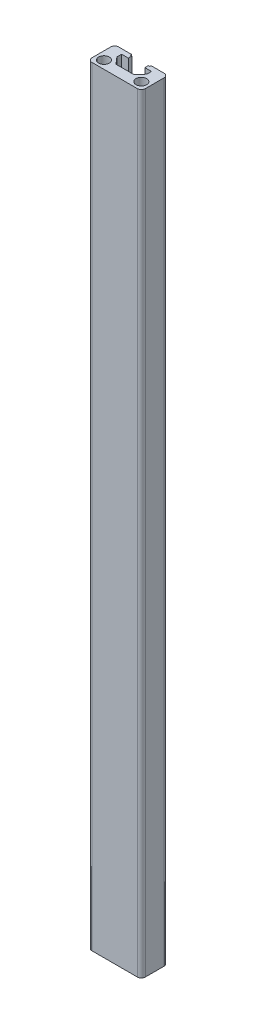
ISO-10303-21;
HEADER;
FILE_DESCRIPTION(('STEP AP214'),'2;1');
FILE_NAME('part.step','',(''),(''),'','','');
FILE_SCHEMA(('AUTOMOTIVE_DESIGN { 1 0 10303 214 1 1 1 1 }'));
ENDSEC;
DATA;
#1=APPLICATION_CONTEXT('core data for automotive mechanical design processes');
#2=APPLICATION_PROTOCOL_DEFINITION('international standard','automotive_design',2000,#1);
#3=PRODUCT_CONTEXT('',#1,'mechanical');
#4=PRODUCT('Part','Part','',(#3));
#5=PRODUCT_RELATED_PRODUCT_CATEGORY('part','',(#4));
#6=PRODUCT_DEFINITION_FORMATION('','',#4);
#7=PRODUCT_DEFINITION_CONTEXT('part definition',#1,'design');
#8=PRODUCT_DEFINITION('design','',#6,#7);
#9=PRODUCT_DEFINITION_SHAPE('','',#8);
#10=(LENGTH_UNIT() NAMED_UNIT(*) SI_UNIT(.MILLI.,.METRE.));
#11=(NAMED_UNIT(*) PLANE_ANGLE_UNIT() SI_UNIT($,.RADIAN.));
#12=(NAMED_UNIT(*) SI_UNIT($,.STERADIAN.) SOLID_ANGLE_UNIT());
#13=UNCERTAINTY_MEASURE_WITH_UNIT(LENGTH_MEASURE(1.E-05),#10,'distance_accuracy_value','');
#14=(GEOMETRIC_REPRESENTATION_CONTEXT(3) GLOBAL_UNCERTAINTY_ASSIGNED_CONTEXT((#13)) GLOBAL_UNIT_ASSIGNED_CONTEXT((#10,
#11,#12)) REPRESENTATION_CONTEXT('',''));
#15=CARTESIAN_POINT('',(0.,0.,0.));
#16=DIRECTION('',(0.,0.,1.));
#17=DIRECTION('',(1.,0.,0.));
#18=AXIS2_PLACEMENT_3D('',#15,#16,#17);
#19=CARTESIAN_POINT('',(0.,288.,0.));
#20=DIRECTION('',(0.,1.,0.));
#21=DIRECTION('',(0.,0.,1.));
#22=AXIS2_PLACEMENT_3D('',#19,#20,#21);
#23=PLANE('',#22);
#24=CARTESIAN_POINT('',(17.,288.,-3.));
#25=DIRECTION('',(0.,1.,0.));
#26=DIRECTION('',(0.,0.,1.));
#27=AXIS2_PLACEMENT_3D('',#24,#25,#26);
#28=CIRCLE('',#27,2.);
#29=CARTESIAN_POINT('',(17.,288.,-0.999999999999997));
#30=VERTEX_POINT('',#29);
#31=EDGE_CURVE('E262',#30,#30,#28,.T.);
#32=ORIENTED_EDGE('',*,*,#31,.F.);
#33=EDGE_LOOP('',(#32));
#34=FACE_BOUND('',#33,.T.);
#35=DIRECTION('',(-1.,0.,0.));
#36=VECTOR('',#35,1.);
#37=CARTESIAN_POINT('',(6.35,288.,-10.));
#38=LINE('',#37,#36);
#39=CARTESIAN_POINT('',(6.35,288.,-10.));
#40=VERTEX_POINT('',#39);
#41=CARTESIAN_POINT('',(1.5,288.,-10.));
#42=VERTEX_POINT('',#41);
#43=EDGE_CURVE('E253',#40,#42,#38,.T.);
#44=ORIENTED_EDGE('',*,*,#43,.T.);
#45=CARTESIAN_POINT('',(1.5,288.,-8.5));
#46=DIRECTION('',(0.,1.,0.));
#47=DIRECTION('',(0.,0.,1.));
#48=AXIS2_PLACEMENT_3D('',#45,#46,#47);
#49=CIRCLE('',#48,1.5);
#50=CARTESIAN_POINT('',(0.,288.,-8.5));
#51=VERTEX_POINT('',#50);
#52=EDGE_CURVE('E393',#42,#51,#49,.T.);
#53=ORIENTED_EDGE('',*,*,#52,.T.);
#54=DIRECTION('',(0.,0.,1.));
#55=VECTOR('',#54,1.);
#56=CARTESIAN_POINT('',(0.,288.,-10.));
#57=LINE('',#56,#55);
#58=CARTESIAN_POINT('',(0.,288.,-1.5));
#59=VERTEX_POINT('',#58);
#60=EDGE_CURVE('E314',#51,#59,#57,.T.);
#61=ORIENTED_EDGE('',*,*,#60,.T.);
#62=CARTESIAN_POINT('',(1.5,288.,-1.5));
#63=DIRECTION('',(0.,1.,0.));
#64=DIRECTION('',(0.,0.,1.));
#65=AXIS2_PLACEMENT_3D('',#62,#63,#64);
#66=CIRCLE('',#65,1.5);
#67=CARTESIAN_POINT('',(1.5,288.,0.));
#68=VERTEX_POINT('',#67);
#69=EDGE_CURVE('E390',#59,#68,#66,.T.);
#70=ORIENTED_EDGE('',*,*,#69,.T.);
#71=DIRECTION('',(1.,0.,0.));
#72=VECTOR('',#71,1.);
#73=CARTESIAN_POINT('',(0.,288.,0.));
#74=LINE('',#73,#72);
#75=CARTESIAN_POINT('',(18.5,288.,0.));
#76=VERTEX_POINT('',#75);
#77=EDGE_CURVE('E522',#68,#76,#74,.T.);
#78=ORIENTED_EDGE('',*,*,#77,.T.);
#79=CARTESIAN_POINT('',(18.5,288.,-1.5));
#80=DIRECTION('',(0.,1.,0.));
#81=DIRECTION('',(0.,0.,1.));
#82=AXIS2_PLACEMENT_3D('',#79,#80,#81);
#83=CIRCLE('',#82,1.5);
#84=CARTESIAN_POINT('',(20.,288.,-1.5));
#85=VERTEX_POINT('',#84);
#86=EDGE_CURVE('E385',#76,#85,#83,.T.);
#87=ORIENTED_EDGE('',*,*,#86,.T.);
#88=DIRECTION('',(0.,0.,-1.));
#89=VECTOR('',#88,1.);
#90=CARTESIAN_POINT('',(20.,288.,0.));
#91=LINE('',#90,#89);
#92=CARTESIAN_POINT('',(20.,288.,-8.5));
#93=VERTEX_POINT('',#92);
#94=EDGE_CURVE('E197',#85,#93,#91,.T.);
#95=ORIENTED_EDGE('',*,*,#94,.T.);
#96=CARTESIAN_POINT('',(18.5,288.,-8.5));
#97=DIRECTION('',(0.,1.,0.));
#98=DIRECTION('',(0.,0.,1.));
#99=AXIS2_PLACEMENT_3D('',#96,#97,#98);
#100=CIRCLE('',#99,1.5);
#101=CARTESIAN_POINT('',(18.5,288.,-10.));
#102=VERTEX_POINT('',#101);
#103=EDGE_CURVE('E55',#93,#102,#100,.T.);
#104=ORIENTED_EDGE('',*,*,#103,.T.);
#105=DIRECTION('',(-1.,0.,0.));
#106=VECTOR('',#105,1.);
#107=CARTESIAN_POINT('',(20.,288.,-10.));
#108=LINE('',#107,#106);
#109=CARTESIAN_POINT('',(13.65,288.,-10.));
#110=VERTEX_POINT('',#109);
#111=EDGE_CURVE('E186',#102,#110,#108,.T.);
#112=ORIENTED_EDGE('',*,*,#111,.T.);
#113=DIRECTION('',(0.,0.,1.));
#114=VECTOR('',#113,1.);
#115=CARTESIAN_POINT('',(13.65,288.,-9.51042760217637));
#116=LINE('',#115,#114);
#117=CARTESIAN_POINT('',(13.65,288.,-9.51042760217637));
#118=VERTEX_POINT('',#117);
#119=EDGE_CURVE('E191',#110,#118,#116,.T.);
#120=ORIENTED_EDGE('',*,*,#119,.T.);
#121=DIRECTION('',(-1.,0.,0.));
#122=VECTOR('',#121,1.);
#123=CARTESIAN_POINT('',(13.1,288.,-9.51042760217637));
#124=LINE('',#123,#122);
#125=CARTESIAN_POINT('',(13.1,288.,-9.51042760217637));
#126=VERTEX_POINT('',#125);
#127=EDGE_CURVE('E214',#118,#126,#124,.T.);
#128=ORIENTED_EDGE('',*,*,#127,.T.);
#129=DIRECTION('',(0.,0.,1.));
#130=VECTOR('',#129,1.);
#131=CARTESIAN_POINT('',(13.1,288.,-8.2));
#132=LINE('',#131,#130);
#133=CARTESIAN_POINT('',(13.1,288.,-8.2));
#134=VERTEX_POINT('',#133);
#135=EDGE_CURVE('E217',#126,#134,#132,.T.);
#136=ORIENTED_EDGE('',*,*,#135,.T.);
#137=DIRECTION('',(1.,0.,0.));
#138=VECTOR('',#137,1.);
#139=CARTESIAN_POINT('',(15.6,288.,-8.2));
#140=LINE('',#139,#138);
#141=CARTESIAN_POINT('',(15.6,288.,-8.2));
#142=VERTEX_POINT('',#141);
#143=EDGE_CURVE('E223',#134,#142,#140,.T.);
#144=ORIENTED_EDGE('',*,*,#143,.T.);
#145=DIRECTION('',(0.,0.,1.));
#146=VECTOR('',#145,1.);
#147=CARTESIAN_POINT('',(15.6,288.,-6.44750713590306));
#148=LINE('',#147,#146);
#149=CARTESIAN_POINT('',(15.6,288.,-6.44750713590306));
#150=VERTEX_POINT('',#149);
#151=EDGE_CURVE('E226',#142,#150,#148,.T.);
#152=ORIENTED_EDGE('',*,*,#151,.T.);
#153=DIRECTION('',(-0.651429062487269,0.,0.758709546893248));
#154=VECTOR('',#153,1.);
#155=CARTESIAN_POINT('',(13.4127068625717,288.,-3.9));
#156=LINE('',#155,#154);
#157=CARTESIAN_POINT('',(13.4127068625717,288.,-3.9));
#158=VERTEX_POINT('',#157);
#159=EDGE_CURVE('E229',#150,#158,#156,.T.);
#160=ORIENTED_EDGE('',*,*,#159,.T.);
#161=DIRECTION('',(-1.,0.,0.));
#162=VECTOR('',#161,1.);
#163=CARTESIAN_POINT('',(6.58729313742833,288.,-3.9));
#164=LINE('',#163,#162);
#165=CARTESIAN_POINT('',(6.58729313742833,288.,-3.9));
#166=VERTEX_POINT('',#165);
#167=EDGE_CURVE('E232',#158,#166,#164,.T.);
#168=ORIENTED_EDGE('',*,*,#167,.T.);
#169=DIRECTION('',(-0.651429062487269,0.,-0.758709546893248));
#170=VECTOR('',#169,1.);
#171=CARTESIAN_POINT('',(4.4,288.,-6.44750713590306));
#172=LINE('',#171,#170);
#173=CARTESIAN_POINT('',(4.4,288.,-6.44750713590306));
#174=VERTEX_POINT('',#173);
#175=EDGE_CURVE('E235',#166,#174,#172,.T.);
#176=ORIENTED_EDGE('',*,*,#175,.T.);
#177=DIRECTION('',(0.,0.,-1.));
#178=VECTOR('',#177,1.);
#179=CARTESIAN_POINT('',(4.4,288.,-8.2));
#180=LINE('',#179,#178);
#181=CARTESIAN_POINT('',(4.4,288.,-8.2));
#182=VERTEX_POINT('',#181);
#183=EDGE_CURVE('E238',#174,#182,#180,.T.);
#184=ORIENTED_EDGE('',*,*,#183,.T.);
#185=DIRECTION('',(1.,0.,0.));
#186=VECTOR('',#185,1.);
#187=CARTESIAN_POINT('',(6.9,288.,-8.2));
#188=LINE('',#187,#186);
#189=CARTESIAN_POINT('',(6.9,288.,-8.2));
#190=VERTEX_POINT('',#189);
#191=EDGE_CURVE('E241',#182,#190,#188,.T.);
#192=ORIENTED_EDGE('',*,*,#191,.T.);
#193=DIRECTION('',(0.,0.,-1.));
#194=VECTOR('',#193,1.);
#195=CARTESIAN_POINT('',(6.9,288.,-9.51042760217637));
#196=LINE('',#195,#194);
#197=CARTESIAN_POINT('',(6.9,288.,-9.51042760217637));
#198=VERTEX_POINT('',#197);
#199=EDGE_CURVE('E244',#190,#198,#196,.T.);
#200=ORIENTED_EDGE('',*,*,#199,.T.);
#201=DIRECTION('',(-1.,0.,0.));
#202=VECTOR('',#201,1.);
#203=CARTESIAN_POINT('',(6.35,288.,-9.51042760217637));
#204=LINE('',#203,#202);
#205=CARTESIAN_POINT('',(6.35,288.,-9.51042760217637));
#206=VERTEX_POINT('',#205);
#207=EDGE_CURVE('E247',#198,#206,#204,.T.);
#208=ORIENTED_EDGE('',*,*,#207,.T.);
#209=DIRECTION('',(0.,0.,-1.));
#210=VECTOR('',#209,1.);
#211=CARTESIAN_POINT('',(6.35,288.,-10.));
#212=LINE('',#211,#210);
#213=EDGE_CURVE('E250',#206,#40,#212,.T.);
#214=ORIENTED_EDGE('',*,*,#213,.T.);
#215=EDGE_LOOP('',(#44,#53,#61,#70,#78,#87,#95,#104,#112,#120,#128,#136,#144,#152,#160,#168,
#176,#184,#192,#200,#208,#214));
#216=FACE_BOUND('',#215,.T.);
#217=CARTESIAN_POINT('',(3.,288.,-3.));
#218=DIRECTION('',(0.,1.,0.));
#219=DIRECTION('',(0.,0.,1.));
#220=AXIS2_PLACEMENT_3D('',#217,#218,#219);
#221=CIRCLE('',#220,2.);
#222=CARTESIAN_POINT('',(3.,288.,-1.));
#223=VERTEX_POINT('',#222);
#224=EDGE_CURVE('E572',#223,#223,#221,.T.);
#225=ORIENTED_EDGE('',*,*,#224,.F.);
#226=EDGE_LOOP('',(#225));
#227=FACE_BOUND('',#226,.T.);
#228=ADVANCED_FACE('F39',(#34,#216,#227),#23,.T.);
#229=CARTESIAN_POINT('',(0.,0.,0.));
#230=DIRECTION('',(0.,1.,0.));
#231=DIRECTION('',(0.,0.,1.));
#232=AXIS2_PLACEMENT_3D('',#229,#230,#231);
#233=PLANE('',#232);
#234=DIRECTION('',(0.,0.,1.));
#235=VECTOR('',#234,1.);
#236=CARTESIAN_POINT('',(0.,0.,-10.));
#237=LINE('',#236,#235);
#238=CARTESIAN_POINT('',(0.,0.,-8.5));
#239=VERTEX_POINT('',#238);
#240=CARTESIAN_POINT('',(0.,0.,-1.5));
#241=VERTEX_POINT('',#240);
#242=EDGE_CURVE('E257',#239,#241,#237,.T.);
#243=ORIENTED_EDGE('',*,*,#242,.F.);
#244=CARTESIAN_POINT('',(1.5,0.,-8.5));
#245=DIRECTION('',(0.,1.,0.));
#246=DIRECTION('',(0.,0.,1.));
#247=AXIS2_PLACEMENT_3D('',#244,#245,#246);
#248=CIRCLE('',#247,1.5);
#249=CARTESIAN_POINT('',(1.5,0.,-10.));
#250=VERTEX_POINT('',#249);
#251=EDGE_CURVE('E379',#239,#250,#248,.F.);
#252=ORIENTED_EDGE('',*,*,#251,.T.);
#253=DIRECTION('',(-1.,0.,0.));
#254=VECTOR('',#253,1.);
#255=CARTESIAN_POINT('',(6.35,0.,-10.));
#256=LINE('',#255,#254);
#257=CARTESIAN_POINT('',(6.35,0.,-10.));
#258=VERTEX_POINT('',#257);
#259=EDGE_CURVE('E310',#258,#250,#256,.T.);
#260=ORIENTED_EDGE('',*,*,#259,.F.);
#261=DIRECTION('',(0.,0.,-1.));
#262=VECTOR('',#261,1.);
#263=CARTESIAN_POINT('',(6.35,0.,-10.));
#264=LINE('',#263,#262);
#265=CARTESIAN_POINT('',(6.35,0.,-9.51042760217637));
#266=VERTEX_POINT('',#265);
#267=EDGE_CURVE('E307',#266,#258,#264,.T.);
#268=ORIENTED_EDGE('',*,*,#267,.F.);
#269=DIRECTION('',(-1.,0.,0.));
#270=VECTOR('',#269,1.);
#271=CARTESIAN_POINT('',(6.35,0.,-9.51042760217637));
#272=LINE('',#271,#270);
#273=CARTESIAN_POINT('',(6.9,0.,-9.51042760217637));
#274=VERTEX_POINT('',#273);
#275=EDGE_CURVE('E304',#274,#266,#272,.T.);
#276=ORIENTED_EDGE('',*,*,#275,.F.);
#277=DIRECTION('',(0.,0.,-1.));
#278=VECTOR('',#277,1.);
#279=CARTESIAN_POINT('',(6.9,0.,-9.51042760217637));
#280=LINE('',#279,#278);
#281=CARTESIAN_POINT('',(6.9,0.,-8.2));
#282=VERTEX_POINT('',#281);
#283=EDGE_CURVE('E301',#282,#274,#280,.T.);
#284=ORIENTED_EDGE('',*,*,#283,.F.);
#285=DIRECTION('',(1.,0.,0.));
#286=VECTOR('',#285,1.);
#287=CARTESIAN_POINT('',(6.9,0.,-8.2));
#288=LINE('',#287,#286);
#289=CARTESIAN_POINT('',(4.4,0.,-8.2));
#290=VERTEX_POINT('',#289);
#291=EDGE_CURVE('E298',#290,#282,#288,.T.);
#292=ORIENTED_EDGE('',*,*,#291,.F.);
#293=DIRECTION('',(0.,0.,-1.));
#294=VECTOR('',#293,1.);
#295=CARTESIAN_POINT('',(4.4,0.,-8.2));
#296=LINE('',#295,#294);
#297=CARTESIAN_POINT('',(4.4,0.,-6.44750713590306));
#298=VERTEX_POINT('',#297);
#299=EDGE_CURVE('E295',#298,#290,#296,.T.);
#300=ORIENTED_EDGE('',*,*,#299,.F.);
#301=DIRECTION('',(-0.651429062487269,0.,-0.758709546893248));
#302=VECTOR('',#301,1.);
#303=CARTESIAN_POINT('',(4.4,0.,-6.44750713590306));
#304=LINE('',#303,#302);
#305=CARTESIAN_POINT('',(6.58729313742833,0.,-3.9));
#306=VERTEX_POINT('',#305);
#307=EDGE_CURVE('E292',#306,#298,#304,.T.);
#308=ORIENTED_EDGE('',*,*,#307,.F.);
#309=DIRECTION('',(-1.,0.,0.));
#310=VECTOR('',#309,1.);
#311=CARTESIAN_POINT('',(6.58729313742833,0.,-3.9));
#312=LINE('',#311,#310);
#313=CARTESIAN_POINT('',(13.4127068625717,0.,-3.9));
#314=VERTEX_POINT('',#313);
#315=EDGE_CURVE('E289',#314,#306,#312,.T.);
#316=ORIENTED_EDGE('',*,*,#315,.F.);
#317=DIRECTION('',(-0.651429062487269,0.,0.758709546893248));
#318=VECTOR('',#317,1.);
#319=CARTESIAN_POINT('',(13.4127068625717,0.,-3.9));
#320=LINE('',#319,#318);
#321=CARTESIAN_POINT('',(15.6,0.,-6.44750713590306));
#322=VERTEX_POINT('',#321);
#323=EDGE_CURVE('E286',#322,#314,#320,.T.);
#324=ORIENTED_EDGE('',*,*,#323,.F.);
#325=DIRECTION('',(0.,0.,1.));
#326=VECTOR('',#325,1.);
#327=CARTESIAN_POINT('',(15.6,0.,-6.44750713590306));
#328=LINE('',#327,#326);
#329=CARTESIAN_POINT('',(15.6,0.,-8.2));
#330=VERTEX_POINT('',#329);
#331=EDGE_CURVE('E283',#330,#322,#328,.T.);
#332=ORIENTED_EDGE('',*,*,#331,.F.);
#333=DIRECTION('',(1.,0.,0.));
#334=VECTOR('',#333,1.);
#335=CARTESIAN_POINT('',(15.6,0.,-8.2));
#336=LINE('',#335,#334);
#337=CARTESIAN_POINT('',(13.1,0.,-8.2));
#338=VERTEX_POINT('',#337);
#339=EDGE_CURVE('E280',#338,#330,#336,.T.);
#340=ORIENTED_EDGE('',*,*,#339,.F.);
#341=DIRECTION('',(0.,0.,1.));
#342=VECTOR('',#341,1.);
#343=CARTESIAN_POINT('',(13.1,0.,-8.2));
#344=LINE('',#343,#342);
#345=CARTESIAN_POINT('',(13.1,0.,-9.51042760217637));
#346=VERTEX_POINT('',#345);
#347=EDGE_CURVE('E277',#346,#338,#344,.T.);
#348=ORIENTED_EDGE('',*,*,#347,.F.);
#349=DIRECTION('',(-1.,0.,0.));
#350=VECTOR('',#349,1.);
#351=CARTESIAN_POINT('',(13.1,0.,-9.51042760217637));
#352=LINE('',#351,#350);
#353=CARTESIAN_POINT('',(13.65,0.,-9.51042760217637));
#354=VERTEX_POINT('',#353);
#355=EDGE_CURVE('E274',#354,#346,#352,.T.);
#356=ORIENTED_EDGE('',*,*,#355,.F.);
#357=DIRECTION('',(0.,0.,1.));
#358=VECTOR('',#357,1.);
#359=CARTESIAN_POINT('',(13.65,0.,-9.51042760217637));
#360=LINE('',#359,#358);
#361=CARTESIAN_POINT('',(13.65,0.,-10.));
#362=VERTEX_POINT('',#361);
#363=EDGE_CURVE('E271',#362,#354,#360,.T.);
#364=ORIENTED_EDGE('',*,*,#363,.F.);
#365=DIRECTION('',(-1.,0.,0.));
#366=VECTOR('',#365,1.);
#367=CARTESIAN_POINT('',(20.,0.,-10.));
#368=LINE('',#367,#366);
#369=CARTESIAN_POINT('',(18.5,0.,-10.));
#370=VERTEX_POINT('',#369);
#371=EDGE_CURVE('E203',#370,#362,#368,.T.);
#372=ORIENTED_EDGE('',*,*,#371,.F.);
#373=CARTESIAN_POINT('',(18.5,0.,-8.5));
#374=DIRECTION('',(0.,1.,0.));
#375=DIRECTION('',(0.,0.,1.));
#376=AXIS2_PLACEMENT_3D('',#373,#374,#375);
#377=CIRCLE('',#376,1.5);
#378=CARTESIAN_POINT('',(20.,0.,-8.5));
#379=VERTEX_POINT('',#378);
#380=EDGE_CURVE('E373',#370,#379,#377,.F.);
#381=ORIENTED_EDGE('',*,*,#380,.T.);
#382=DIRECTION('',(0.,0.,-1.));
#383=VECTOR('',#382,1.);
#384=CARTESIAN_POINT('',(20.,0.,0.));
#385=LINE('',#384,#383);
#386=CARTESIAN_POINT('',(20.,0.,-1.5));
#387=VERTEX_POINT('',#386);
#388=EDGE_CURVE('E266',#387,#379,#385,.T.);
#389=ORIENTED_EDGE('',*,*,#388,.F.);
#390=CARTESIAN_POINT('',(18.5,0.,-1.5));
#391=DIRECTION('',(0.,1.,0.));
#392=DIRECTION('',(0.,0.,1.));
#393=AXIS2_PLACEMENT_3D('',#390,#391,#392);
#394=CIRCLE('',#393,1.5);
#395=CARTESIAN_POINT('',(18.5,0.,0.));
#396=VERTEX_POINT('',#395);
#397=EDGE_CURVE('E370',#387,#396,#394,.F.);
#398=ORIENTED_EDGE('',*,*,#397,.T.);
#399=DIRECTION('',(1.,0.,0.));
#400=VECTOR('',#399,1.);
#401=CARTESIAN_POINT('',(0.,0.,0.));
#402=LINE('',#401,#400);
#403=CARTESIAN_POINT('',(1.5,0.,0.));
#404=VERTEX_POINT('',#403);
#405=EDGE_CURVE('E261',#404,#396,#402,.T.);
#406=ORIENTED_EDGE('',*,*,#405,.F.);
#407=CARTESIAN_POINT('',(1.5,0.,-1.5));
#408=DIRECTION('',(0.,1.,0.));
#409=DIRECTION('',(0.,0.,1.));
#410=AXIS2_PLACEMENT_3D('',#407,#408,#409);
#411=CIRCLE('',#410,1.5);
#412=EDGE_CURVE('E376',#404,#241,#411,.F.);
#413=ORIENTED_EDGE('',*,*,#412,.T.);
#414=EDGE_LOOP('',(#243,#252,#260,#268,#276,#284,#292,#300,#308,#316,#324,#332,#340,#348,#356,
#364,#372,#381,#389,#398,#406,#413));
#415=FACE_BOUND('',#414,.T.);
#416=CARTESIAN_POINT('',(17.,0.,-3.));
#417=DIRECTION('',(0.,1.,0.));
#418=DIRECTION('',(0.,0.,1.));
#419=AXIS2_PLACEMENT_3D('',#416,#417,#418);
#420=CIRCLE('',#419,2.);
#421=CARTESIAN_POINT('',(17.,0.,-0.999999999999997));
#422=VERTEX_POINT('',#421);
#423=EDGE_CURVE('E528',#422,#422,#420,.T.);
#424=ORIENTED_EDGE('',*,*,#423,.T.);
#425=EDGE_LOOP('',(#424));
#426=FACE_BOUND('',#425,.T.);
#427=CARTESIAN_POINT('',(3.,0.,-3.));
#428=DIRECTION('',(0.,1.,0.));
#429=DIRECTION('',(0.,0.,1.));
#430=AXIS2_PLACEMENT_3D('',#427,#428,#429);
#431=CIRCLE('',#430,2.);
#432=CARTESIAN_POINT('',(3.,0.,-1.));
#433=VERTEX_POINT('',#432);
#434=EDGE_CURVE('E576',#433,#433,#431,.T.);
#435=ORIENTED_EDGE('',*,*,#434,.T.);
#436=EDGE_LOOP('',(#435));
#437=FACE_BOUND('',#436,.T.);
#438=ADVANCED_FACE('F414',(#415,#426,#437),#233,.F.);
#439=CARTESIAN_POINT('',(0.,288.,-10.));
#440=DIRECTION('',(1.,0.,0.));
#441=DIRECTION('',(0.,0.,-1.));
#442=AXIS2_PLACEMENT_3D('',#439,#440,#441);
#443=PLANE('',#442);
#444=ORIENTED_EDGE('',*,*,#60,.F.);
#445=DIRECTION('',(0.,-1.,0.));
#446=VECTOR('',#445,1.);
#447=CARTESIAN_POINT('',(0.,288.,-8.5));
#448=LINE('',#447,#446);
#449=EDGE_CURVE('E366',#51,#239,#448,.T.);
#450=ORIENTED_EDGE('',*,*,#449,.T.);
#451=ORIENTED_EDGE('',*,*,#242,.T.);
#452=DIRECTION('',(0.,-1.,0.));
#453=VECTOR('',#452,1.);
#454=CARTESIAN_POINT('',(0.,288.,-1.5));
#455=LINE('',#454,#453);
#456=EDGE_CURVE('E207',#241,#59,#455,.F.);
#457=ORIENTED_EDGE('',*,*,#456,.T.);
#458=EDGE_LOOP('',(#444,#450,#451,#457));
#459=FACE_BOUND('',#458,.T.);
#460=ADVANCED_FACE('F434',(#459),#443,.F.);
#461=CARTESIAN_POINT('',(0.,288.,0.));
#462=DIRECTION('',(0.,0.,-1.));
#463=DIRECTION('',(-1.,0.,0.));
#464=AXIS2_PLACEMENT_3D('',#461,#462,#463);
#465=PLANE('',#464);
#466=ORIENTED_EDGE('',*,*,#77,.F.);
#467=DIRECTION('',(0.,-1.,0.));
#468=VECTOR('',#467,1.);
#469=CARTESIAN_POINT('',(1.5,288.,0.));
#470=LINE('',#469,#468);
#471=EDGE_CURVE('E399',#68,#404,#470,.T.);
#472=ORIENTED_EDGE('',*,*,#471,.T.);
#473=ORIENTED_EDGE('',*,*,#405,.T.);
#474=DIRECTION('',(0.,-1.,0.));
#475=VECTOR('',#474,1.);
#476=CARTESIAN_POINT('',(18.5,288.,0.));
#477=LINE('',#476,#475);
#478=EDGE_CURVE('E396',#396,#76,#477,.F.);
#479=ORIENTED_EDGE('',*,*,#478,.T.);
#480=EDGE_LOOP('',(#466,#472,#473,#479));
#481=FACE_BOUND('',#480,.T.);
#482=ADVANCED_FACE('F499',(#481),#465,.F.);
#483=CARTESIAN_POINT('',(20.,288.,0.));
#484=DIRECTION('',(-1.,0.,0.));
#485=DIRECTION('',(0.,0.,1.));
#486=AXIS2_PLACEMENT_3D('',#483,#484,#485);
#487=PLANE('',#486);
#488=ORIENTED_EDGE('',*,*,#388,.T.);
#489=DIRECTION('',(0.,-1.,0.));
#490=VECTOR('',#489,1.);
#491=CARTESIAN_POINT('',(20.,288.,-8.5));
#492=LINE('',#491,#490);
#493=EDGE_CURVE('E11',#379,#93,#492,.F.);
#494=ORIENTED_EDGE('',*,*,#493,.T.);
#495=ORIENTED_EDGE('',*,*,#94,.F.);
#496=DIRECTION('',(0.,-1.,0.));
#497=VECTOR('',#496,1.);
#498=CARTESIAN_POINT('',(20.,288.,-1.5));
#499=LINE('',#498,#497);
#500=EDGE_CURVE('E48',#85,#387,#499,.T.);
#501=ORIENTED_EDGE('',*,*,#500,.T.);
#502=EDGE_LOOP('',(#488,#494,#495,#501));
#503=FACE_BOUND('',#502,.T.);
#504=ADVANCED_FACE('F409',(#503),#487,.F.);
#505=CARTESIAN_POINT('',(20.,288.,-10.));
#506=DIRECTION('',(0.,0.,1.));
#507=DIRECTION('',(1.,0.,0.));
#508=AXIS2_PLACEMENT_3D('',#505,#506,#507);
#509=PLANE('',#508);
#510=ORIENTED_EDGE('',*,*,#111,.F.);
#511=DIRECTION('',(0.,-1.,0.));
#512=VECTOR('',#511,1.);
#513=CARTESIAN_POINT('',(18.5,288.,-10.));
#514=LINE('',#513,#512);
#515=EDGE_CURVE('E403',#102,#370,#514,.T.);
#516=ORIENTED_EDGE('',*,*,#515,.T.);
#517=ORIENTED_EDGE('',*,*,#371,.T.);
#518=DIRECTION('',(0.,-1.,0.));
#519=VECTOR('',#518,1.);
#520=CARTESIAN_POINT('',(13.65,288.,-10.));
#521=LINE('',#520,#519);
#522=EDGE_CURVE('E200',#110,#362,#521,.T.);
#523=ORIENTED_EDGE('',*,*,#522,.F.);
#524=EDGE_LOOP('',(#510,#516,#517,#523));
#525=FACE_BOUND('',#524,.T.);
#526=ADVANCED_FACE('F201',(#525),#509,.F.);
#527=CARTESIAN_POINT('',(13.65,288.,-9.51042760217637));
#528=DIRECTION('',(1.,0.,0.));
#529=DIRECTION('',(0.,0.,-1.));
#530=AXIS2_PLACEMENT_3D('',#527,#528,#529);
#531=PLANE('',#530);
#532=ORIENTED_EDGE('',*,*,#363,.T.);
#533=DIRECTION('',(0.,-1.,0.));
#534=VECTOR('',#533,1.);
#535=CARTESIAN_POINT('',(13.65,288.,-9.51042760217637));
#536=LINE('',#535,#534);
#537=EDGE_CURVE('E208',#118,#354,#536,.T.);
#538=ORIENTED_EDGE('',*,*,#537,.F.);
#539=ORIENTED_EDGE('',*,*,#119,.F.);
#540=ORIENTED_EDGE('',*,*,#522,.T.);
#541=EDGE_LOOP('',(#532,#538,#539,#540));
#542=FACE_BOUND('',#541,.T.);
#543=ADVANCED_FACE('F210',(#542),#531,.F.);
#544=CARTESIAN_POINT('',(13.1,288.,-9.51042760217637));
#545=DIRECTION('',(0.,0.,1.));
#546=DIRECTION('',(1.,0.,0.));
#547=AXIS2_PLACEMENT_3D('',#544,#545,#546);
#548=PLANE('',#547);
#549=ORIENTED_EDGE('',*,*,#355,.T.);
#550=DIRECTION('',(0.,-1.,0.));
#551=VECTOR('',#550,1.);
#552=CARTESIAN_POINT('',(13.1,288.,-9.51042760217637));
#553=LINE('',#552,#551);
#554=EDGE_CURVE('E358',#126,#346,#553,.T.);
#555=ORIENTED_EDGE('',*,*,#554,.F.);
#556=ORIENTED_EDGE('',*,*,#127,.F.);
#557=ORIENTED_EDGE('',*,*,#537,.T.);
#558=EDGE_LOOP('',(#549,#555,#556,#557));
#559=FACE_BOUND('',#558,.T.);
#560=ADVANCED_FACE('F488',(#559),#548,.F.);
#561=CARTESIAN_POINT('',(13.1,288.,-8.2));
#562=DIRECTION('',(1.,0.,0.));
#563=DIRECTION('',(0.,0.,-1.));
#564=AXIS2_PLACEMENT_3D('',#561,#562,#563);
#565=PLANE('',#564);
#566=ORIENTED_EDGE('',*,*,#347,.T.);
#567=DIRECTION('',(0.,-1.,0.));
#568=VECTOR('',#567,1.);
#569=CARTESIAN_POINT('',(13.1,288.,-8.2));
#570=LINE('',#569,#568);
#571=EDGE_CURVE('E354',#134,#338,#570,.T.);
#572=ORIENTED_EDGE('',*,*,#571,.F.);
#573=ORIENTED_EDGE('',*,*,#135,.F.);
#574=ORIENTED_EDGE('',*,*,#554,.T.);
#575=EDGE_LOOP('',(#566,#572,#573,#574));
#576=FACE_BOUND('',#575,.T.);
#577=ADVANCED_FACE('F484',(#576),#565,.F.);
#578=CARTESIAN_POINT('',(15.6,288.,-8.2));
#579=DIRECTION('',(0.,0.,-1.));
#580=DIRECTION('',(-1.,0.,0.));
#581=AXIS2_PLACEMENT_3D('',#578,#579,#580);
#582=PLANE('',#581);
#583=ORIENTED_EDGE('',*,*,#339,.T.);
#584=DIRECTION('',(0.,-1.,0.));
#585=VECTOR('',#584,1.);
#586=CARTESIAN_POINT('',(15.6,288.,-8.2));
#587=LINE('',#586,#585);
#588=EDGE_CURVE('E350',#142,#330,#587,.T.);
#589=ORIENTED_EDGE('',*,*,#588,.F.);
#590=ORIENTED_EDGE('',*,*,#143,.F.);
#591=ORIENTED_EDGE('',*,*,#571,.T.);
#592=EDGE_LOOP('',(#583,#589,#590,#591));
#593=FACE_BOUND('',#592,.T.);
#594=ADVANCED_FACE('F480',(#593),#582,.F.);
#595=CARTESIAN_POINT('',(15.6,288.,-6.44750713590306));
#596=DIRECTION('',(1.,0.,0.));
#597=DIRECTION('',(0.,0.,-1.));
#598=AXIS2_PLACEMENT_3D('',#595,#596,#597);
#599=PLANE('',#598);
#600=ORIENTED_EDGE('',*,*,#331,.T.);
#601=DIRECTION('',(0.,-1.,0.));
#602=VECTOR('',#601,1.);
#603=CARTESIAN_POINT('',(15.6,288.,-6.44750713590306));
#604=LINE('',#603,#602);
#605=EDGE_CURVE('E346',#150,#322,#604,.T.);
#606=ORIENTED_EDGE('',*,*,#605,.F.);
#607=ORIENTED_EDGE('',*,*,#151,.F.);
#608=ORIENTED_EDGE('',*,*,#588,.T.);
#609=EDGE_LOOP('',(#600,#606,#607,#608));
#610=FACE_BOUND('',#609,.T.);
#611=ADVANCED_FACE('F476',(#610),#599,.F.);
#612=CARTESIAN_POINT('',(13.4127068625717,288.,-3.9));
#613=DIRECTION('',(0.758709546893248,0.,0.651429062487269));
#614=DIRECTION('',(0.651429062487269,0.,-0.758709546893248));
#615=AXIS2_PLACEMENT_3D('',#612,#613,#614);
#616=PLANE('',#615);
#617=ORIENTED_EDGE('',*,*,#323,.T.);
#618=DIRECTION('',(0.,-1.,0.));
#619=VECTOR('',#618,1.);
#620=CARTESIAN_POINT('',(13.4127068625717,288.,-3.9));
#621=LINE('',#620,#619);
#622=EDGE_CURVE('E342',#158,#314,#621,.T.);
#623=ORIENTED_EDGE('',*,*,#622,.F.);
#624=ORIENTED_EDGE('',*,*,#159,.F.);
#625=ORIENTED_EDGE('',*,*,#605,.T.);
#626=EDGE_LOOP('',(#617,#623,#624,#625));
#627=FACE_BOUND('',#626,.T.);
#628=ADVANCED_FACE('F472',(#627),#616,.F.);
#629=CARTESIAN_POINT('',(6.58729313742833,288.,-3.9));
#630=DIRECTION('',(0.,0.,1.));
#631=DIRECTION('',(1.,0.,0.));
#632=AXIS2_PLACEMENT_3D('',#629,#630,#631);
#633=PLANE('',#632);
#634=ORIENTED_EDGE('',*,*,#315,.T.);
#635=DIRECTION('',(0.,-1.,0.));
#636=VECTOR('',#635,1.);
#637=CARTESIAN_POINT('',(6.58729313742833,288.,-3.9));
#638=LINE('',#637,#636);
#639=EDGE_CURVE('E338',#166,#306,#638,.T.);
#640=ORIENTED_EDGE('',*,*,#639,.F.);
#641=ORIENTED_EDGE('',*,*,#167,.F.);
#642=ORIENTED_EDGE('',*,*,#622,.T.);
#643=EDGE_LOOP('',(#634,#640,#641,#642));
#644=FACE_BOUND('',#643,.T.);
#645=ADVANCED_FACE('F468',(#644),#633,.F.);
#646=CARTESIAN_POINT('',(4.4,288.,-6.44750713590306));
#647=DIRECTION('',(-0.758709546893248,0.,0.651429062487269));
#648=DIRECTION('',(0.651429062487269,0.,0.758709546893248));
#649=AXIS2_PLACEMENT_3D('',#646,#647,#648);
#650=PLANE('',#649);
#651=ORIENTED_EDGE('',*,*,#307,.T.);
#652=DIRECTION('',(0.,-1.,0.));
#653=VECTOR('',#652,1.);
#654=CARTESIAN_POINT('',(4.4,288.,-6.44750713590306));
#655=LINE('',#654,#653);
#656=EDGE_CURVE('E334',#174,#298,#655,.T.);
#657=ORIENTED_EDGE('',*,*,#656,.F.);
#658=ORIENTED_EDGE('',*,*,#175,.F.);
#659=ORIENTED_EDGE('',*,*,#639,.T.);
#660=EDGE_LOOP('',(#651,#657,#658,#659));
#661=FACE_BOUND('',#660,.T.);
#662=ADVANCED_FACE('F464',(#661),#650,.F.);
#663=CARTESIAN_POINT('',(4.4,288.,-8.2));
#664=DIRECTION('',(-1.,0.,0.));
#665=DIRECTION('',(0.,0.,1.));
#666=AXIS2_PLACEMENT_3D('',#663,#664,#665);
#667=PLANE('',#666);
#668=ORIENTED_EDGE('',*,*,#299,.T.);
#669=DIRECTION('',(0.,-1.,0.));
#670=VECTOR('',#669,1.);
#671=CARTESIAN_POINT('',(4.4,288.,-8.2));
#672=LINE('',#671,#670);
#673=EDGE_CURVE('E330',#182,#290,#672,.T.);
#674=ORIENTED_EDGE('',*,*,#673,.F.);
#675=ORIENTED_EDGE('',*,*,#183,.F.);
#676=ORIENTED_EDGE('',*,*,#656,.T.);
#677=EDGE_LOOP('',(#668,#674,#675,#676));
#678=FACE_BOUND('',#677,.T.);
#679=ADVANCED_FACE('F460',(#678),#667,.F.);
#680=CARTESIAN_POINT('',(6.9,288.,-8.2));
#681=DIRECTION('',(0.,0.,-1.));
#682=DIRECTION('',(-1.,0.,0.));
#683=AXIS2_PLACEMENT_3D('',#680,#681,#682);
#684=PLANE('',#683);
#685=ORIENTED_EDGE('',*,*,#291,.T.);
#686=DIRECTION('',(0.,-1.,0.));
#687=VECTOR('',#686,1.);
#688=CARTESIAN_POINT('',(6.9,288.,-8.2));
#689=LINE('',#688,#687);
#690=EDGE_CURVE('E326',#190,#282,#689,.T.);
#691=ORIENTED_EDGE('',*,*,#690,.F.);
#692=ORIENTED_EDGE('',*,*,#191,.F.);
#693=ORIENTED_EDGE('',*,*,#673,.T.);
#694=EDGE_LOOP('',(#685,#691,#692,#693));
#695=FACE_BOUND('',#694,.T.);
#696=ADVANCED_FACE('F456',(#695),#684,.F.);
#697=CARTESIAN_POINT('',(6.9,288.,-9.51042760217637));
#698=DIRECTION('',(-1.,0.,0.));
#699=DIRECTION('',(0.,0.,1.));
#700=AXIS2_PLACEMENT_3D('',#697,#698,#699);
#701=PLANE('',#700);
#702=ORIENTED_EDGE('',*,*,#283,.T.);
#703=DIRECTION('',(0.,-1.,0.));
#704=VECTOR('',#703,1.);
#705=CARTESIAN_POINT('',(6.9,288.,-9.51042760217637));
#706=LINE('',#705,#704);
#707=EDGE_CURVE('E322',#198,#274,#706,.T.);
#708=ORIENTED_EDGE('',*,*,#707,.F.);
#709=ORIENTED_EDGE('',*,*,#199,.F.);
#710=ORIENTED_EDGE('',*,*,#690,.T.);
#711=EDGE_LOOP('',(#702,#708,#709,#710));
#712=FACE_BOUND('',#711,.T.);
#713=ADVANCED_FACE('F452',(#712),#701,.F.);
#714=CARTESIAN_POINT('',(6.35,288.,-9.51042760217637));
#715=DIRECTION('',(0.,0.,1.));
#716=DIRECTION('',(1.,0.,0.));
#717=AXIS2_PLACEMENT_3D('',#714,#715,#716);
#718=PLANE('',#717);
#719=ORIENTED_EDGE('',*,*,#275,.T.);
#720=DIRECTION('',(0.,-1.,0.));
#721=VECTOR('',#720,1.);
#722=CARTESIAN_POINT('',(6.35,288.,-9.51042760217637));
#723=LINE('',#722,#721);
#724=EDGE_CURVE('E318',#206,#266,#723,.T.);
#725=ORIENTED_EDGE('',*,*,#724,.F.);
#726=ORIENTED_EDGE('',*,*,#207,.F.);
#727=ORIENTED_EDGE('',*,*,#707,.T.);
#728=EDGE_LOOP('',(#719,#725,#726,#727));
#729=FACE_BOUND('',#728,.T.);
#730=ADVANCED_FACE('F448',(#729),#718,.F.);
#731=CARTESIAN_POINT('',(6.35,288.,-10.));
#732=DIRECTION('',(-1.,0.,0.));
#733=DIRECTION('',(0.,0.,1.));
#734=AXIS2_PLACEMENT_3D('',#731,#732,#733);
#735=PLANE('',#734);
#736=ORIENTED_EDGE('',*,*,#267,.T.);
#737=DIRECTION('',(0.,-1.,0.));
#738=VECTOR('',#737,1.);
#739=CARTESIAN_POINT('',(6.35,288.,-10.));
#740=LINE('',#739,#738);
#741=EDGE_CURVE('E256',#40,#258,#740,.T.);
#742=ORIENTED_EDGE('',*,*,#741,.F.);
#743=ORIENTED_EDGE('',*,*,#213,.F.);
#744=ORIENTED_EDGE('',*,*,#724,.T.);
#745=EDGE_LOOP('',(#736,#742,#743,#744));
#746=FACE_BOUND('',#745,.T.);
#747=ADVANCED_FACE('F444',(#746),#735,.F.);
#748=CARTESIAN_POINT('',(6.35,288.,-10.));
#749=DIRECTION('',(0.,0.,1.));
#750=DIRECTION('',(1.,0.,0.));
#751=AXIS2_PLACEMENT_3D('',#748,#749,#750);
#752=PLANE('',#751);
#753=ORIENTED_EDGE('',*,*,#259,.T.);
#754=DIRECTION('',(0.,-1.,0.));
#755=VECTOR('',#754,1.);
#756=CARTESIAN_POINT('',(1.5,288.,-10.));
#757=LINE('',#756,#755);
#758=EDGE_CURVE('E382',#250,#42,#757,.F.);
#759=ORIENTED_EDGE('',*,*,#758,.T.);
#760=ORIENTED_EDGE('',*,*,#43,.F.);
#761=ORIENTED_EDGE('',*,*,#741,.T.);
#762=EDGE_LOOP('',(#753,#759,#760,#761));
#763=FACE_BOUND('',#762,.T.);
#764=ADVANCED_FACE('F441',(#763),#752,.F.);
#765=CARTESIAN_POINT('',(17.,288.,-3.));
#766=DIRECTION('',(0.,-1.,0.));
#767=DIRECTION('',(0.,0.,-1.));
#768=AXIS2_PLACEMENT_3D('',#765,#766,#767);
#769=CYLINDRICAL_SURFACE('',#768,2.);
#770=ORIENTED_EDGE('',*,*,#31,.T.);
#771=EDGE_LOOP('',(#770));
#772=FACE_BOUND('',#771,.T.);
#773=ORIENTED_EDGE('',*,*,#423,.F.);
#774=EDGE_LOOP('',(#773));
#775=FACE_BOUND('',#774,.T.);
#776=ADVANCED_FACE('F438',(#772,#775),#769,.F.);
#777=CARTESIAN_POINT('',(3.,288.,-3.));
#778=DIRECTION('',(0.,-1.,0.));
#779=DIRECTION('',(0.,0.,-1.));
#780=AXIS2_PLACEMENT_3D('',#777,#778,#779);
#781=CYLINDRICAL_SURFACE('',#780,2.);
#782=ORIENTED_EDGE('',*,*,#224,.T.);
#783=EDGE_LOOP('',(#782));
#784=FACE_BOUND('',#783,.T.);
#785=ORIENTED_EDGE('',*,*,#434,.F.);
#786=EDGE_LOOP('',(#785));
#787=FACE_BOUND('',#786,.T.);
#788=ADVANCED_FACE('F507',(#784,#787),#781,.F.);
#789=CARTESIAN_POINT('',(1.5,288.,-8.5));
#790=DIRECTION('',(0.,-1.,0.));
#791=DIRECTION('',(0.,0.,-1.));
#792=AXIS2_PLACEMENT_3D('',#789,#790,#791);
#793=CYLINDRICAL_SURFACE('',#792,1.5);
#794=ORIENTED_EDGE('',*,*,#52,.F.);
#795=ORIENTED_EDGE('',*,*,#758,.F.);
#796=ORIENTED_EDGE('',*,*,#251,.F.);
#797=ORIENTED_EDGE('',*,*,#449,.F.);
#798=EDGE_LOOP('',(#794,#795,#796,#797));
#799=FACE_BOUND('',#798,.T.);
#800=ADVANCED_FACE('F425',(#799),#793,.T.);
#801=CARTESIAN_POINT('',(1.5,288.,-1.5));
#802=DIRECTION('',(0.,-1.,0.));
#803=DIRECTION('',(0.,0.,-1.));
#804=AXIS2_PLACEMENT_3D('',#801,#802,#803);
#805=CYLINDRICAL_SURFACE('',#804,1.5);
#806=ORIENTED_EDGE('',*,*,#69,.F.);
#807=ORIENTED_EDGE('',*,*,#456,.F.);
#808=ORIENTED_EDGE('',*,*,#412,.F.);
#809=ORIENTED_EDGE('',*,*,#471,.F.);
#810=EDGE_LOOP('',(#806,#807,#808,#809));
#811=FACE_BOUND('',#810,.T.);
#812=ADVANCED_FACE('F420',(#811),#805,.T.);
#813=CARTESIAN_POINT('',(18.5,288.,-8.5));
#814=DIRECTION('',(0.,-1.,0.));
#815=DIRECTION('',(0.,0.,-1.));
#816=AXIS2_PLACEMENT_3D('',#813,#814,#815);
#817=CYLINDRICAL_SURFACE('',#816,1.5);
#818=ORIENTED_EDGE('',*,*,#103,.F.);
#819=ORIENTED_EDGE('',*,*,#493,.F.);
#820=ORIENTED_EDGE('',*,*,#380,.F.);
#821=ORIENTED_EDGE('',*,*,#515,.F.);
#822=EDGE_LOOP('',(#818,#819,#820,#821));
#823=FACE_BOUND('',#822,.T.);
#824=ADVANCED_FACE('F418',(#823),#817,.T.);
#825=CARTESIAN_POINT('',(18.5,288.,-1.5));
#826=DIRECTION('',(0.,-1.,0.));
#827=DIRECTION('',(0.,0.,-1.));
#828=AXIS2_PLACEMENT_3D('',#825,#826,#827);
#829=CYLINDRICAL_SURFACE('',#828,1.5);
#830=ORIENTED_EDGE('',*,*,#86,.F.);
#831=ORIENTED_EDGE('',*,*,#478,.F.);
#832=ORIENTED_EDGE('',*,*,#397,.F.);
#833=ORIENTED_EDGE('',*,*,#500,.F.);
#834=EDGE_LOOP('',(#830,#831,#832,#833));
#835=FACE_BOUND('',#834,.T.);
#836=ADVANCED_FACE('F41',(#835),#829,.T.);
#837=CLOSED_SHELL('',(#228,#438,#460,#482,#504,#526,#543,#560,#577,#594,#611,#628,#645,#662,
#679,#696,#713,#730,#747,#764,#776,#788,#800,#812,#824,#836));
#838=MANIFOLD_SOLID_BREP('B2',#837);
#839=ADVANCED_BREP_SHAPE_REPRESENTATION('',(#18,#838),#14);
#840=SHAPE_DEFINITION_REPRESENTATION(#9,#839);
ENDSEC;
END-ISO-10303-21;
